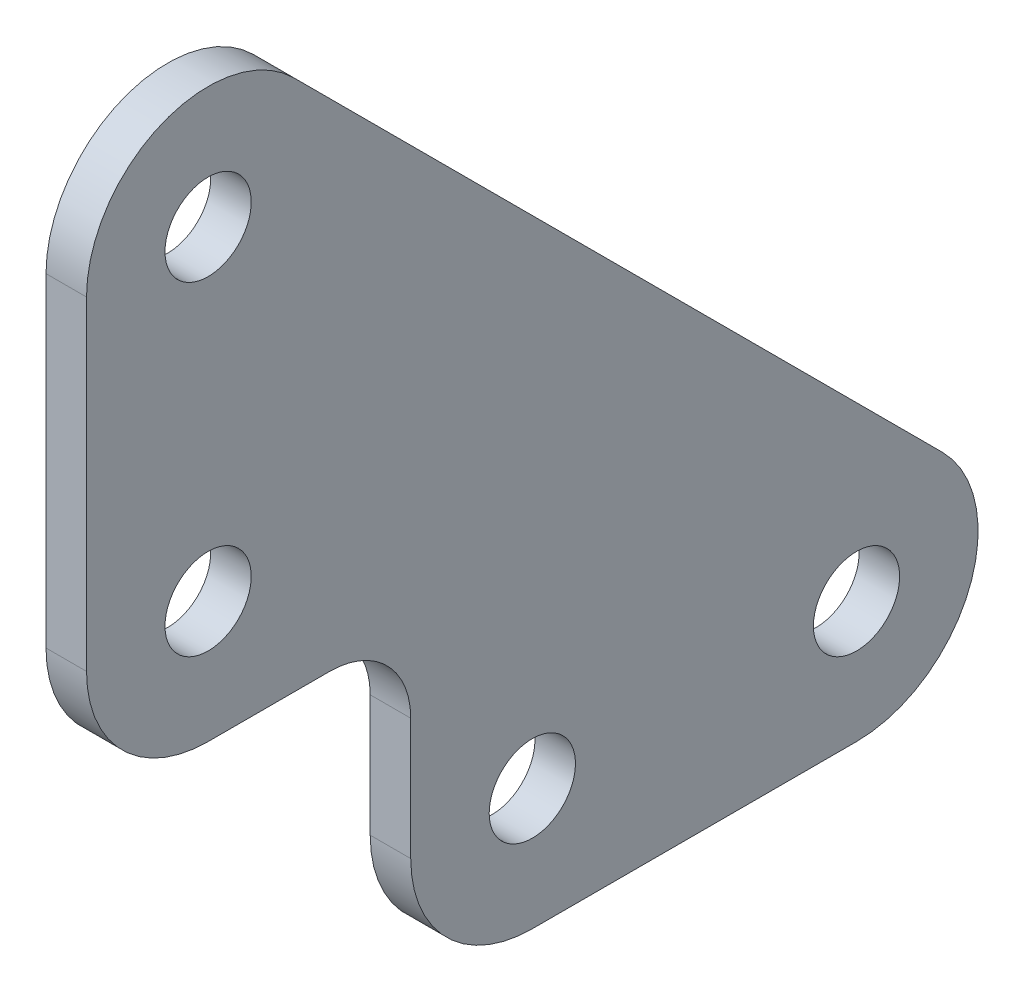
ISO-10303-21;
HEADER;
FILE_DESCRIPTION(('STEP AP214'),'2;1');
FILE_NAME('part.step','',(''),(''),'','','');
FILE_SCHEMA(('AUTOMOTIVE_DESIGN { 1 0 10303 214 1 1 1 1 }'));
ENDSEC;
DATA;
#1=APPLICATION_CONTEXT('core data for automotive mechanical design processes');
#2=APPLICATION_PROTOCOL_DEFINITION('international standard','automotive_design',2000,#1);
#3=PRODUCT_CONTEXT('',#1,'mechanical');
#4=PRODUCT('Part','Part','',(#3));
#5=PRODUCT_RELATED_PRODUCT_CATEGORY('part','',(#4));
#6=PRODUCT_DEFINITION_FORMATION('','',#4);
#7=PRODUCT_DEFINITION_CONTEXT('part definition',#1,'design');
#8=PRODUCT_DEFINITION('design','',#6,#7);
#9=PRODUCT_DEFINITION_SHAPE('','',#8);
#10=(LENGTH_UNIT() NAMED_UNIT(*) SI_UNIT(.MILLI.,.METRE.));
#11=(NAMED_UNIT(*) PLANE_ANGLE_UNIT() SI_UNIT($,.RADIAN.));
#12=(NAMED_UNIT(*) SI_UNIT($,.STERADIAN.) SOLID_ANGLE_UNIT());
#13=UNCERTAINTY_MEASURE_WITH_UNIT(LENGTH_MEASURE(1.E-05),#10,'distance_accuracy_value','');
#14=(GEOMETRIC_REPRESENTATION_CONTEXT(3) GLOBAL_UNCERTAINTY_ASSIGNED_CONTEXT((#13)) GLOBAL_UNIT_ASSIGNED_CONTEXT((#10,
#11,#12)) REPRESENTATION_CONTEXT('',''));
#15=CARTESIAN_POINT('',(0.,0.,0.));
#16=DIRECTION('',(0.,0.,1.));
#17=DIRECTION('',(1.,0.,0.));
#18=AXIS2_PLACEMENT_3D('',#15,#16,#17);
#19=CARTESIAN_POINT('',(92.8688124839999,195.704574554,1328.475334154));
#20=DIRECTION('',(1.,0.,0.));
#21=DIRECTION('',(0.,0.,-1.));
#22=AXIS2_PLACEMENT_3D('',#19,#20,#21);
#23=PLANE('',#22);
#24=CARTESIAN_POINT('',(92.8688124839999,195.704574554,1328.475334154));
#25=DIRECTION('',(-1.,0.,0.));
#26=DIRECTION('',(0.,0.,1.));
#27=AXIS2_PLACEMENT_3D('',#24,#25,#26);
#28=CIRCLE('',#27,3.3782);
#29=CARTESIAN_POINT('',(92.8688124839999,195.704574554,1331.853534154));
#30=VERTEX_POINT('',#29);
#31=EDGE_CURVE('E369',#30,#30,#28,.T.);
#32=ORIENTED_EDGE('',*,*,#31,.F.);
#33=EDGE_LOOP('',(#32));
#34=FACE_BOUND('',#33,.T.);
#35=CARTESIAN_POINT('',(92.8688124839999,144.904574554,1277.675334154));
#36=DIRECTION('',(-1.,0.,0.));
#37=DIRECTION('',(0.,0.,1.));
#38=AXIS2_PLACEMENT_3D('',#35,#36,#37);
#39=CIRCLE('',#38,3.3782);
#40=CARTESIAN_POINT('',(92.8688124839999,144.904574554,1281.053534154));
#41=VERTEX_POINT('',#40);
#42=EDGE_CURVE('E366',#41,#41,#39,.T.);
#43=ORIENTED_EDGE('',*,*,#42,.F.);
#44=EDGE_LOOP('',(#43));
#45=FACE_BOUND('',#44,.T.);
#46=CARTESIAN_POINT('',(92.8688124839999,144.904574554,1303.075334154));
#47=DIRECTION('',(-1.,0.,0.));
#48=DIRECTION('',(0.,0.,1.));
#49=AXIS2_PLACEMENT_3D('',#46,#47,#48);
#50=CIRCLE('',#49,3.3782);
#51=CARTESIAN_POINT('',(92.8688124839999,144.904574554,1306.453534154));
#52=VERTEX_POINT('',#51);
#53=EDGE_CURVE('E377',#52,#52,#50,.T.);
#54=ORIENTED_EDGE('',*,*,#53,.F.);
#55=EDGE_LOOP('',(#54));
#56=FACE_BOUND('',#55,.T.);
#57=CARTESIAN_POINT('',(92.8688124839999,195.704574554,1328.475334154));
#58=DIRECTION('',(1.,0.,0.));
#59=DIRECTION('',(0.,0.,-1.));
#60=AXIS2_PLACEMENT_3D('',#57,#58,#59);
#61=CIRCLE('',#60,9.52500000000001);
#62=CARTESIAN_POINT('',(92.8688124839999,202.439766644802,1321.7401420632));
#63=VERTEX_POINT('',#62);
#64=CARTESIAN_POINT('',(92.8688124839999,195.704574554,1338.000334154));
#65=VERTEX_POINT('',#64);
#66=EDGE_CURVE('E132',#63,#65,#61,.T.);
#67=ORIENTED_EDGE('',*,*,#66,.F.);
#68=DIRECTION('',(0.,0.707106781186549,0.707106781186547));
#69=VECTOR('',#68,1.);
#70=CARTESIAN_POINT('',(92.8688124839999,202.439766644802,1321.7401420632));
#71=LINE('',#70,#69);
#72=CARTESIAN_POINT('',(92.8688124839999,151.639766644802,1270.9401420632));
#73=VERTEX_POINT('',#72);
#74=EDGE_CURVE('E125',#73,#63,#71,.T.);
#75=ORIENTED_EDGE('',*,*,#74,.F.);
#76=CARTESIAN_POINT('',(92.8688124839999,144.904574554,1277.675334154));
#77=DIRECTION('',(1.,0.,0.));
#78=DIRECTION('',(0.,0.,-1.));
#79=AXIS2_PLACEMENT_3D('',#76,#77,#78);
#80=CIRCLE('',#79,9.52500000000001);
#81=CARTESIAN_POINT('',(92.8688124839999,135.379574554,1277.675334154));
#82=VERTEX_POINT('',#81);
#83=EDGE_CURVE('E161',#82,#73,#80,.T.);
#84=ORIENTED_EDGE('',*,*,#83,.F.);
#85=DIRECTION('',(0.,0.,-1.));
#86=VECTOR('',#85,1.);
#87=CARTESIAN_POINT('',(92.8688124839999,135.379574554,1303.075334154));
#88=LINE('',#87,#86);
#89=CARTESIAN_POINT('',(92.8688124839999,135.379574554,1303.075334154));
#90=VERTEX_POINT('',#89);
#91=EDGE_CURVE('E158',#90,#82,#88,.T.);
#92=ORIENTED_EDGE('',*,*,#91,.F.);
#93=CARTESIAN_POINT('',(92.8688124839999,144.904574554,1303.075334154));
#94=DIRECTION('',(1.,0.,0.));
#95=DIRECTION('',(0.,0.,-1.));
#96=AXIS2_PLACEMENT_3D('',#93,#94,#95);
#97=CIRCLE('',#96,9.52500000000001);
#98=CARTESIAN_POINT('',(92.8688124839999,144.904574554,1312.600334154));
#99=VERTEX_POINT('',#98);
#100=EDGE_CURVE('E155',#99,#90,#97,.T.);
#101=ORIENTED_EDGE('',*,*,#100,.F.);
#102=DIRECTION('',(0.,-1.,0.));
#103=VECTOR('',#102,1.);
#104=CARTESIAN_POINT('',(92.8688124839999,160.779574554,1312.600334154));
#105=LINE('',#104,#103);
#106=CARTESIAN_POINT('',(92.8688124839999,154.429574554,1312.600334154));
#107=VERTEX_POINT('',#106);
#108=EDGE_CURVE('E153',#107,#99,#105,.T.);
#109=ORIENTED_EDGE('',*,*,#108,.F.);
#110=CARTESIAN_POINT('',(92.8688124839999,154.429574554,1318.950334154));
#111=DIRECTION('',(1.,0.,0.));
#112=DIRECTION('',(0.,0.,-1.));
#113=AXIS2_PLACEMENT_3D('',#110,#111,#112);
#114=CIRCLE('',#113,6.35);
#115=CARTESIAN_POINT('',(92.8688124839999,160.779574554,1318.950334154));
#116=VERTEX_POINT('',#115);
#117=EDGE_CURVE('E11',#107,#116,#114,.T.);
#118=ORIENTED_EDGE('',*,*,#117,.T.);
#119=DIRECTION('',(0.,0.,-1.));
#120=VECTOR('',#119,1.);
#121=CARTESIAN_POINT('',(92.8688124839999,160.779574554,1328.475334154));
#122=LINE('',#121,#120);
#123=CARTESIAN_POINT('',(92.8688124839999,160.779574554,1328.475334154));
#124=VERTEX_POINT('',#123);
#125=EDGE_CURVE('E150',#124,#116,#122,.T.);
#126=ORIENTED_EDGE('',*,*,#125,.F.);
#127=CARTESIAN_POINT('',(92.8688124839999,170.304574554,1328.475334154));
#128=DIRECTION('',(1.,0.,0.));
#129=DIRECTION('',(0.,0.,-1.));
#130=AXIS2_PLACEMENT_3D('',#127,#128,#129);
#131=CIRCLE('',#130,9.52500000000001);
#132=CARTESIAN_POINT('',(92.8688124839999,170.304574554,1338.000334154));
#133=VERTEX_POINT('',#132);
#134=EDGE_CURVE('E136',#133,#124,#131,.T.);
#135=ORIENTED_EDGE('',*,*,#134,.F.);
#136=DIRECTION('',(0.,-1.,0.));
#137=VECTOR('',#136,1.);
#138=CARTESIAN_POINT('',(92.8688124839999,170.304574554,1338.000334154));
#139=LINE('',#138,#137);
#140=EDGE_CURVE('E117',#65,#133,#139,.T.);
#141=ORIENTED_EDGE('',*,*,#140,.F.);
#142=EDGE_LOOP('',(#67,#75,#84,#92,#101,#109,#118,#126,#135,#141));
#143=FACE_BOUND('',#142,.T.);
#144=CARTESIAN_POINT('',(92.8688124839999,170.304574554,1328.475334154));
#145=DIRECTION('',(-1.,0.,0.));
#146=DIRECTION('',(0.,0.,1.));
#147=AXIS2_PLACEMENT_3D('',#144,#145,#146);
#148=CIRCLE('',#147,3.3782);
#149=CARTESIAN_POINT('',(92.8688124839999,170.304574554,1331.853534154));
#150=VERTEX_POINT('',#149);
#151=EDGE_CURVE('E363',#150,#150,#148,.T.);
#152=ORIENTED_EDGE('',*,*,#151,.F.);
#153=EDGE_LOOP('',(#152));
#154=FACE_BOUND('',#153,.T.);
#155=ADVANCED_FACE('F39',(#34,#45,#56,#143,#154),#23,.F.);
#156=CARTESIAN_POINT('',(92.8688124839999,195.704574554,1328.475334154));
#157=DIRECTION('',(1.,0.,0.));
#158=DIRECTION('',(0.,0.,-1.));
#159=AXIS2_PLACEMENT_3D('',#156,#157,#158);
#160=CYLINDRICAL_SURFACE('',#159,9.52500000000001);
#161=CARTESIAN_POINT('',(96.0438124839999,195.704574554,1328.475334154));
#162=DIRECTION('',(1.,0.,0.));
#163=DIRECTION('',(0.,0.,-1.));
#164=AXIS2_PLACEMENT_3D('',#161,#162,#163);
#165=CIRCLE('',#164,9.52500000000001);
#166=CARTESIAN_POINT('',(96.0438124839999,202.439766644802,1321.7401420632));
#167=VERTEX_POINT('',#166);
#168=CARTESIAN_POINT('',(96.0438124839999,195.704574554,1338.000334154));
#169=VERTEX_POINT('',#168);
#170=EDGE_CURVE('E165',#167,#169,#165,.T.);
#171=ORIENTED_EDGE('',*,*,#170,.F.);
#172=DIRECTION('',(1.,0.,0.));
#173=VECTOR('',#172,1.);
#174=CARTESIAN_POINT('',(92.8688124839999,202.439766644802,1321.7401420632));
#175=LINE('',#174,#173);
#176=EDGE_CURVE('E139',#63,#167,#175,.T.);
#177=ORIENTED_EDGE('',*,*,#176,.F.);
#178=ORIENTED_EDGE('',*,*,#66,.T.);
#179=DIRECTION('',(1.,0.,0.));
#180=VECTOR('',#179,1.);
#181=CARTESIAN_POINT('',(92.8688124839999,195.704574554,1338.000334154));
#182=LINE('',#181,#180);
#183=EDGE_CURVE('E114',#65,#169,#182,.T.);
#184=ORIENTED_EDGE('',*,*,#183,.T.);
#185=EDGE_LOOP('',(#171,#177,#178,#184));
#186=FACE_BOUND('',#185,.T.);
#187=ADVANCED_FACE('F138',(#186),#160,.T.);
#188=CARTESIAN_POINT('',(92.8688124839999,202.439766644802,1321.7401420632));
#189=DIRECTION('',(0.,0.707106781186547,-0.707106781186548));
#190=DIRECTION('',(0.,0.707106781186548,0.707106781186547));
#191=AXIS2_PLACEMENT_3D('',#188,#189,#190);
#192=PLANE('',#191);
#193=DIRECTION('',(0.,0.707106781186549,0.707106781186547));
#194=VECTOR('',#193,1.);
#195=CARTESIAN_POINT('',(96.0438124839999,202.439766644802,1321.7401420632));
#196=LINE('',#195,#194);
#197=CARTESIAN_POINT('',(96.0438124839999,151.639766644802,1270.9401420632));
#198=VERTEX_POINT('',#197);
#199=EDGE_CURVE('E140',#198,#167,#196,.T.);
#200=ORIENTED_EDGE('',*,*,#199,.F.);
#201=DIRECTION('',(1.,0.,0.));
#202=VECTOR('',#201,1.);
#203=CARTESIAN_POINT('',(92.8688124839999,151.639766644802,1270.9401420632));
#204=LINE('',#203,#202);
#205=EDGE_CURVE('E185',#73,#198,#204,.T.);
#206=ORIENTED_EDGE('',*,*,#205,.F.);
#207=ORIENTED_EDGE('',*,*,#74,.T.);
#208=ORIENTED_EDGE('',*,*,#176,.T.);
#209=EDGE_LOOP('',(#200,#206,#207,#208));
#210=FACE_BOUND('',#209,.T.);
#211=ADVANCED_FACE('F226',(#210),#192,.T.);
#212=CARTESIAN_POINT('',(92.8688124839999,144.904574554,1277.675334154));
#213=DIRECTION('',(1.,0.,0.));
#214=DIRECTION('',(0.,0.,-1.));
#215=AXIS2_PLACEMENT_3D('',#212,#213,#214);
#216=CYLINDRICAL_SURFACE('',#215,9.52500000000001);
#217=CARTESIAN_POINT('',(96.0438124839999,144.904574554,1277.675334154));
#218=DIRECTION('',(1.,0.,0.));
#219=DIRECTION('',(0.,0.,-1.));
#220=AXIS2_PLACEMENT_3D('',#217,#218,#219);
#221=CIRCLE('',#220,9.52500000000001);
#222=CARTESIAN_POINT('',(96.0438124839999,135.379574554,1277.675334154));
#223=VERTEX_POINT('',#222);
#224=EDGE_CURVE('E143',#223,#198,#221,.T.);
#225=ORIENTED_EDGE('',*,*,#224,.F.);
#226=DIRECTION('',(1.,0.,0.));
#227=VECTOR('',#226,1.);
#228=CARTESIAN_POINT('',(92.8688124839999,135.379574554,1277.675334154));
#229=LINE('',#228,#227);
#230=EDGE_CURVE('E187',#82,#223,#229,.T.);
#231=ORIENTED_EDGE('',*,*,#230,.F.);
#232=ORIENTED_EDGE('',*,*,#83,.T.);
#233=ORIENTED_EDGE('',*,*,#205,.T.);
#234=EDGE_LOOP('',(#225,#231,#232,#233));
#235=FACE_BOUND('',#234,.T.);
#236=ADVANCED_FACE('F237',(#235),#216,.T.);
#237=CARTESIAN_POINT('',(92.8688124839999,135.379574554,1303.075334154));
#238=DIRECTION('',(0.,-1.,0.));
#239=DIRECTION('',(0.,0.,-1.));
#240=AXIS2_PLACEMENT_3D('',#237,#238,#239);
#241=PLANE('',#240);
#242=DIRECTION('',(0.,0.,-1.));
#243=VECTOR('',#242,1.);
#244=CARTESIAN_POINT('',(96.0438124839999,135.379574554,1303.075334154));
#245=LINE('',#244,#243);
#246=CARTESIAN_POINT('',(96.0438124839999,135.379574554,1303.075334154));
#247=VERTEX_POINT('',#246);
#248=EDGE_CURVE('E178',#247,#223,#245,.T.);
#249=ORIENTED_EDGE('',*,*,#248,.F.);
#250=DIRECTION('',(1.,0.,0.));
#251=VECTOR('',#250,1.);
#252=CARTESIAN_POINT('',(92.8688124839999,135.379574554,1303.075334154));
#253=LINE('',#252,#251);
#254=EDGE_CURVE('E189',#90,#247,#253,.T.);
#255=ORIENTED_EDGE('',*,*,#254,.F.);
#256=ORIENTED_EDGE('',*,*,#91,.T.);
#257=ORIENTED_EDGE('',*,*,#230,.T.);
#258=EDGE_LOOP('',(#249,#255,#256,#257));
#259=FACE_BOUND('',#258,.T.);
#260=ADVANCED_FACE('F241',(#259),#241,.T.);
#261=CARTESIAN_POINT('',(92.8688124839999,144.904574554,1303.075334154));
#262=DIRECTION('',(1.,0.,0.));
#263=DIRECTION('',(0.,0.,-1.));
#264=AXIS2_PLACEMENT_3D('',#261,#262,#263);
#265=CYLINDRICAL_SURFACE('',#264,9.52500000000001);
#266=CARTESIAN_POINT('',(96.0438124839999,144.904574554,1303.075334154));
#267=DIRECTION('',(1.,0.,0.));
#268=DIRECTION('',(0.,0.,-1.));
#269=AXIS2_PLACEMENT_3D('',#266,#267,#268);
#270=CIRCLE('',#269,9.52500000000001);
#271=CARTESIAN_POINT('',(96.0438124839999,144.904574554,1312.600334154));
#272=VERTEX_POINT('',#271);
#273=EDGE_CURVE('E175',#272,#247,#270,.T.);
#274=ORIENTED_EDGE('',*,*,#273,.F.);
#275=DIRECTION('',(1.,0.,0.));
#276=VECTOR('',#275,1.);
#277=CARTESIAN_POINT('',(92.8688124839999,144.904574554,1312.600334154));
#278=LINE('',#277,#276);
#279=EDGE_CURVE('E191',#99,#272,#278,.T.);
#280=ORIENTED_EDGE('',*,*,#279,.F.);
#281=ORIENTED_EDGE('',*,*,#100,.T.);
#282=ORIENTED_EDGE('',*,*,#254,.T.);
#283=EDGE_LOOP('',(#274,#280,#281,#282));
#284=FACE_BOUND('',#283,.T.);
#285=ADVANCED_FACE('F245',(#284),#265,.T.);
#286=CARTESIAN_POINT('',(92.8688124839999,160.779574554,1312.600334154));
#287=DIRECTION('',(0.,0.,1.));
#288=DIRECTION('',(1.,0.,0.));
#289=AXIS2_PLACEMENT_3D('',#286,#287,#288);
#290=PLANE('',#289);
#291=DIRECTION('',(0.,-1.,0.));
#292=VECTOR('',#291,1.);
#293=CARTESIAN_POINT('',(96.0438124839999,160.779574554,1312.600334154));
#294=LINE('',#293,#292);
#295=CARTESIAN_POINT('',(96.0438124839999,154.429574554,1312.600334154));
#296=VERTEX_POINT('',#295);
#297=EDGE_CURVE('E173',#296,#272,#294,.T.);
#298=ORIENTED_EDGE('',*,*,#297,.F.);
#299=DIRECTION('',(1.,0.,0.));
#300=VECTOR('',#299,1.);
#301=CARTESIAN_POINT('',(92.8688124839999,154.429574554,1312.600334154));
#302=LINE('',#301,#300);
#303=EDGE_CURVE('E54',#296,#107,#302,.F.);
#304=ORIENTED_EDGE('',*,*,#303,.T.);
#305=ORIENTED_EDGE('',*,*,#108,.T.);
#306=ORIENTED_EDGE('',*,*,#279,.T.);
#307=EDGE_LOOP('',(#298,#304,#305,#306));
#308=FACE_BOUND('',#307,.T.);
#309=ADVANCED_FACE('F249',(#308),#290,.T.);
#310=CARTESIAN_POINT('',(92.8688124839999,160.779574554,1328.475334154));
#311=DIRECTION('',(0.,-1.,0.));
#312=DIRECTION('',(0.,0.,-1.));
#313=AXIS2_PLACEMENT_3D('',#310,#311,#312);
#314=PLANE('',#313);
#315=ORIENTED_EDGE('',*,*,#125,.T.);
#316=DIRECTION('',(1.,0.,0.));
#317=VECTOR('',#316,1.);
#318=CARTESIAN_POINT('',(96.0438124839999,160.779574554,1318.950334154));
#319=LINE('',#318,#317);
#320=CARTESIAN_POINT('',(96.0438124839999,160.779574554,1318.950334154));
#321=VERTEX_POINT('',#320);
#322=EDGE_CURVE('E184',#116,#321,#319,.T.);
#323=ORIENTED_EDGE('',*,*,#322,.T.);
#324=DIRECTION('',(0.,0.,-1.));
#325=VECTOR('',#324,1.);
#326=CARTESIAN_POINT('',(96.0438124839999,160.779574554,1328.475334154));
#327=LINE('',#326,#325);
#328=CARTESIAN_POINT('',(96.0438124839999,160.779574554,1328.475334154));
#329=VERTEX_POINT('',#328);
#330=EDGE_CURVE('E171',#329,#321,#327,.T.);
#331=ORIENTED_EDGE('',*,*,#330,.F.);
#332=DIRECTION('',(1.,0.,0.));
#333=VECTOR('',#332,1.);
#334=CARTESIAN_POINT('',(92.8688124839999,160.779574554,1328.475334154));
#335=LINE('',#334,#333);
#336=EDGE_CURVE('E194',#124,#329,#335,.T.);
#337=ORIENTED_EDGE('',*,*,#336,.F.);
#338=EDGE_LOOP('',(#315,#323,#331,#337));
#339=FACE_BOUND('',#338,.T.);
#340=ADVANCED_FACE('F202',(#339),#314,.T.);
#341=CARTESIAN_POINT('',(92.8688124839999,170.304574554,1328.475334154));
#342=DIRECTION('',(1.,0.,0.));
#343=DIRECTION('',(0.,0.,-1.));
#344=AXIS2_PLACEMENT_3D('',#341,#342,#343);
#345=CYLINDRICAL_SURFACE('',#344,9.52500000000001);
#346=CARTESIAN_POINT('',(96.0438124839999,170.304574554,1328.475334154));
#347=DIRECTION('',(1.,0.,0.));
#348=DIRECTION('',(0.,0.,-1.));
#349=AXIS2_PLACEMENT_3D('',#346,#347,#348);
#350=CIRCLE('',#349,9.52500000000001);
#351=CARTESIAN_POINT('',(96.0438124839999,170.304574554,1338.000334154));
#352=VERTEX_POINT('',#351);
#353=EDGE_CURVE('E168',#352,#329,#350,.T.);
#354=ORIENTED_EDGE('',*,*,#353,.F.);
#355=DIRECTION('',(1.,0.,0.));
#356=VECTOR('',#355,1.);
#357=CARTESIAN_POINT('',(92.8688124839999,170.304574554,1338.000334154));
#358=LINE('',#357,#356);
#359=EDGE_CURVE('E124',#133,#352,#358,.T.);
#360=ORIENTED_EDGE('',*,*,#359,.F.);
#361=ORIENTED_EDGE('',*,*,#134,.T.);
#362=ORIENTED_EDGE('',*,*,#336,.T.);
#363=EDGE_LOOP('',(#354,#360,#361,#362));
#364=FACE_BOUND('',#363,.T.);
#365=ADVANCED_FACE('F208',(#364),#345,.T.);
#366=CARTESIAN_POINT('',(92.8688124839999,170.304574554,1338.000334154));
#367=DIRECTION('',(0.,0.,1.));
#368=DIRECTION('',(1.,0.,0.));
#369=AXIS2_PLACEMENT_3D('',#366,#367,#368);
#370=PLANE('',#369);
#371=DIRECTION('',(0.,-1.,0.));
#372=VECTOR('',#371,1.);
#373=CARTESIAN_POINT('',(96.0438124839999,170.304574554,1338.000334154));
#374=LINE('',#373,#372);
#375=EDGE_CURVE('E119',#169,#352,#374,.T.);
#376=ORIENTED_EDGE('',*,*,#375,.F.);
#377=ORIENTED_EDGE('',*,*,#183,.F.);
#378=ORIENTED_EDGE('',*,*,#140,.T.);
#379=ORIENTED_EDGE('',*,*,#359,.T.);
#380=EDGE_LOOP('',(#376,#377,#378,#379));
#381=FACE_BOUND('',#380,.T.);
#382=ADVANCED_FACE('F116',(#381),#370,.T.);
#383=CARTESIAN_POINT('',(96.0438124839999,195.704574554,1328.475334154));
#384=DIRECTION('',(1.,0.,0.));
#385=DIRECTION('',(0.,0.,-1.));
#386=AXIS2_PLACEMENT_3D('',#383,#384,#385);
#387=PLANE('',#386);
#388=CARTESIAN_POINT('',(96.0438124839999,195.704574554,1328.475334154));
#389=DIRECTION('',(-1.,0.,0.));
#390=DIRECTION('',(0.,0.,1.));
#391=AXIS2_PLACEMENT_3D('',#388,#389,#390);
#392=CIRCLE('',#391,3.3782);
#393=CARTESIAN_POINT('',(96.0438124839999,195.704574554,1331.853534154));
#394=VERTEX_POINT('',#393);
#395=EDGE_CURVE('E364',#394,#394,#392,.T.);
#396=ORIENTED_EDGE('',*,*,#395,.T.);
#397=EDGE_LOOP('',(#396));
#398=FACE_BOUND('',#397,.T.);
#399=CARTESIAN_POINT('',(96.0438124839999,170.304574554,1328.475334154));
#400=DIRECTION('',(-1.,0.,0.));
#401=DIRECTION('',(0.,0.,1.));
#402=AXIS2_PLACEMENT_3D('',#399,#400,#401);
#403=CIRCLE('',#402,3.3782);
#404=CARTESIAN_POINT('',(96.0438124839999,170.304574554,1331.853534154));
#405=VERTEX_POINT('',#404);
#406=EDGE_CURVE('E360',#405,#405,#403,.T.);
#407=ORIENTED_EDGE('',*,*,#406,.T.);
#408=EDGE_LOOP('',(#407));
#409=FACE_BOUND('',#408,.T.);
#410=CARTESIAN_POINT('',(96.0438124839999,144.904574554,1277.675334154));
#411=DIRECTION('',(-1.,0.,0.));
#412=DIRECTION('',(0.,0.,1.));
#413=AXIS2_PLACEMENT_3D('',#410,#411,#412);
#414=CIRCLE('',#413,3.3782);
#415=CARTESIAN_POINT('',(96.0438124839999,144.904574554,1281.053534154));
#416=VERTEX_POINT('',#415);
#417=EDGE_CURVE('E375',#416,#416,#414,.T.);
#418=ORIENTED_EDGE('',*,*,#417,.T.);
#419=EDGE_LOOP('',(#418));
#420=FACE_BOUND('',#419,.T.);
#421=CARTESIAN_POINT('',(96.0438124839999,144.904574554,1303.075334154));
#422=DIRECTION('',(-1.,0.,0.));
#423=DIRECTION('',(0.,0.,1.));
#424=AXIS2_PLACEMENT_3D('',#421,#422,#423);
#425=CIRCLE('',#424,3.3782);
#426=CARTESIAN_POINT('',(96.0438124839999,144.904574554,1306.453534154));
#427=VERTEX_POINT('',#426);
#428=EDGE_CURVE('E146',#427,#427,#425,.T.);
#429=ORIENTED_EDGE('',*,*,#428,.T.);
#430=EDGE_LOOP('',(#429));
#431=FACE_BOUND('',#430,.T.);
#432=ORIENTED_EDGE('',*,*,#170,.T.);
#433=ORIENTED_EDGE('',*,*,#375,.T.);
#434=ORIENTED_EDGE('',*,*,#353,.T.);
#435=ORIENTED_EDGE('',*,*,#330,.T.);
#436=CARTESIAN_POINT('',(96.0438124839999,154.429574554,1318.950334154));
#437=DIRECTION('',(1.,0.,0.));
#438=DIRECTION('',(0.,0.,-1.));
#439=AXIS2_PLACEMENT_3D('',#436,#437,#438);
#440=CIRCLE('',#439,6.35);
#441=EDGE_CURVE('E47',#321,#296,#440,.F.);
#442=ORIENTED_EDGE('',*,*,#441,.T.);
#443=ORIENTED_EDGE('',*,*,#297,.T.);
#444=ORIENTED_EDGE('',*,*,#273,.T.);
#445=ORIENTED_EDGE('',*,*,#248,.T.);
#446=ORIENTED_EDGE('',*,*,#224,.T.);
#447=ORIENTED_EDGE('',*,*,#199,.T.);
#448=EDGE_LOOP('',(#432,#433,#434,#435,#442,#443,#444,#445,#446,#447));
#449=FACE_BOUND('',#448,.T.);
#450=ADVANCED_FACE('F205',(#398,#409,#420,#431,#449),#387,.T.);
#451=CARTESIAN_POINT('',(92.8688124839999,144.904574554,1303.075334154));
#452=DIRECTION('',(-1.,0.,0.));
#453=DIRECTION('',(0.,0.,1.));
#454=AXIS2_PLACEMENT_3D('',#451,#452,#453);
#455=CYLINDRICAL_SURFACE('',#454,3.3782);
#456=ORIENTED_EDGE('',*,*,#428,.F.);
#457=EDGE_LOOP('',(#456));
#458=FACE_BOUND('',#457,.T.);
#459=ORIENTED_EDGE('',*,*,#53,.T.);
#460=EDGE_LOOP('',(#459));
#461=FACE_BOUND('',#460,.T.);
#462=ADVANCED_FACE('F231',(#458,#461),#455,.F.);
#463=CARTESIAN_POINT('',(92.8688124839999,144.904574554,1277.675334154));
#464=DIRECTION('',(-1.,0.,0.));
#465=DIRECTION('',(0.,0.,1.));
#466=AXIS2_PLACEMENT_3D('',#463,#464,#465);
#467=CYLINDRICAL_SURFACE('',#466,3.3782);
#468=ORIENTED_EDGE('',*,*,#417,.F.);
#469=EDGE_LOOP('',(#468));
#470=FACE_BOUND('',#469,.T.);
#471=ORIENTED_EDGE('',*,*,#42,.T.);
#472=EDGE_LOOP('',(#471));
#473=FACE_BOUND('',#472,.T.);
#474=ADVANCED_FACE('F269',(#470,#473),#467,.F.);
#475=CARTESIAN_POINT('',(92.8688124839999,170.304574554,1328.475334154));
#476=DIRECTION('',(-1.,0.,0.));
#477=DIRECTION('',(0.,0.,1.));
#478=AXIS2_PLACEMENT_3D('',#475,#476,#477);
#479=CYLINDRICAL_SURFACE('',#478,3.3782);
#480=ORIENTED_EDGE('',*,*,#406,.F.);
#481=EDGE_LOOP('',(#480));
#482=FACE_BOUND('',#481,.T.);
#483=ORIENTED_EDGE('',*,*,#151,.T.);
#484=EDGE_LOOP('',(#483));
#485=FACE_BOUND('',#484,.T.);
#486=ADVANCED_FACE('F216',(#482,#485),#479,.F.);
#487=CARTESIAN_POINT('',(92.8688124839999,195.704574554,1328.475334154));
#488=DIRECTION('',(-1.,0.,0.));
#489=DIRECTION('',(0.,0.,1.));
#490=AXIS2_PLACEMENT_3D('',#487,#488,#489);
#491=CYLINDRICAL_SURFACE('',#490,3.3782);
#492=ORIENTED_EDGE('',*,*,#395,.F.);
#493=EDGE_LOOP('',(#492));
#494=FACE_BOUND('',#493,.T.);
#495=ORIENTED_EDGE('',*,*,#31,.T.);
#496=EDGE_LOOP('',(#495));
#497=FACE_BOUND('',#496,.T.);
#498=ADVANCED_FACE('F211',(#494,#497),#491,.F.);
#499=CARTESIAN_POINT('',(92.8688124839999,154.429574554,1318.950334154));
#500=DIRECTION('',(-1.,0.,0.));
#501=DIRECTION('',(0.,0.,1.));
#502=AXIS2_PLACEMENT_3D('',#499,#500,#501);
#503=CYLINDRICAL_SURFACE('',#502,6.35);
#504=ORIENTED_EDGE('',*,*,#117,.F.);
#505=ORIENTED_EDGE('',*,*,#303,.F.);
#506=ORIENTED_EDGE('',*,*,#441,.F.);
#507=ORIENTED_EDGE('',*,*,#322,.F.);
#508=EDGE_LOOP('',(#504,#505,#506,#507));
#509=FACE_BOUND('',#508,.T.);
#510=ADVANCED_FACE('F41',(#509),#503,.F.);
#511=CLOSED_SHELL('',(#155,#187,#211,#236,#260,#285,#309,#340,#365,#382,#450,#462,#474,#486,
#498,#510));
#512=MANIFOLD_SOLID_BREP('B2',#511);
#513=ADVANCED_BREP_SHAPE_REPRESENTATION('',(#18,#512),#14);
#514=SHAPE_DEFINITION_REPRESENTATION(#9,#513);
ENDSEC;
END-ISO-10303-21;
